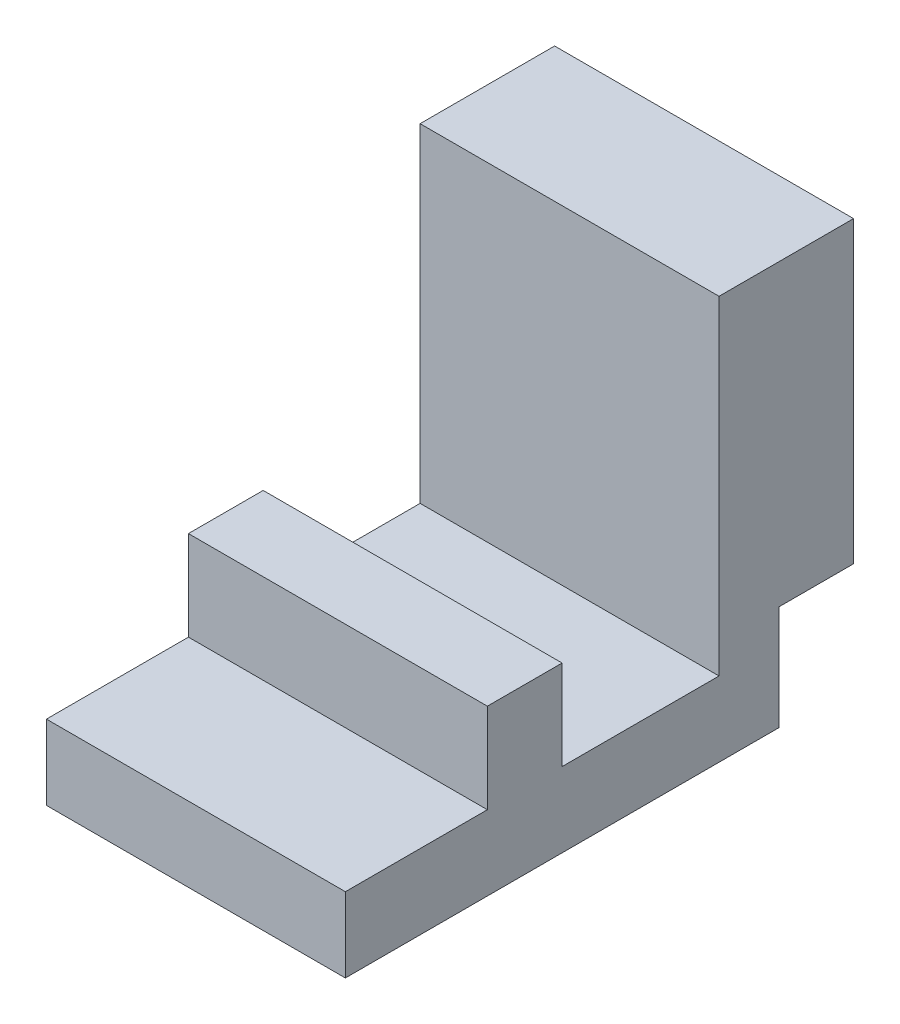
ISO-10303-21;
HEADER;
FILE_DESCRIPTION(('STEP AP214'),'2;1');
FILE_NAME('part.step','',(''),(''),'','','');
FILE_SCHEMA(('AUTOMOTIVE_DESIGN { 1 0 10303 214 1 1 1 1 }'));
ENDSEC;
DATA;
#1=APPLICATION_CONTEXT('core data for automotive mechanical design processes');
#2=APPLICATION_PROTOCOL_DEFINITION('international standard','automotive_design',2000,#1);
#3=PRODUCT_CONTEXT('',#1,'mechanical');
#4=PRODUCT('Part','Part','',(#3));
#5=PRODUCT_RELATED_PRODUCT_CATEGORY('part','',(#4));
#6=PRODUCT_DEFINITION_FORMATION('','',#4);
#7=PRODUCT_DEFINITION_CONTEXT('part definition',#1,'design');
#8=PRODUCT_DEFINITION('design','',#6,#7);
#9=PRODUCT_DEFINITION_SHAPE('','',#8);
#10=(LENGTH_UNIT() NAMED_UNIT(*) SI_UNIT(.MILLI.,.METRE.));
#11=(NAMED_UNIT(*) PLANE_ANGLE_UNIT() SI_UNIT($,.RADIAN.));
#12=(NAMED_UNIT(*) SI_UNIT($,.STERADIAN.) SOLID_ANGLE_UNIT());
#13=UNCERTAINTY_MEASURE_WITH_UNIT(LENGTH_MEASURE(1.E-05),#10,'distance_accuracy_value','');
#14=(GEOMETRIC_REPRESENTATION_CONTEXT(3) GLOBAL_UNCERTAINTY_ASSIGNED_CONTEXT((#13)) GLOBAL_UNIT_ASSIGNED_CONTEXT((#10,
#11,#12)) REPRESENTATION_CONTEXT('',''));
#15=CARTESIAN_POINT('',(0.,0.,0.));
#16=DIRECTION('',(0.,0.,1.));
#17=DIRECTION('',(1.,0.,0.));
#18=AXIS2_PLACEMENT_3D('',#15,#16,#17);
#19=CARTESIAN_POINT('',(20.,0.,58.));
#20=DIRECTION('',(0.,1.,0.));
#21=DIRECTION('',(0.,0.,1.));
#22=AXIS2_PLACEMENT_3D('',#19,#20,#21);
#23=PLANE('',#22);
#24=DIRECTION('',(0.,0.,-1.));
#25=VECTOR('',#24,1.);
#26=CARTESIAN_POINT('',(-20.,0.,58.));
#27=LINE('',#26,#25);
#28=CARTESIAN_POINT('',(-20.,0.,58.));
#29=VERTEX_POINT('',#28);
#30=CARTESIAN_POINT('',(-20.,0.,0.));
#31=VERTEX_POINT('',#30);
#32=EDGE_CURVE('E159',#29,#31,#27,.T.);
#33=ORIENTED_EDGE('',*,*,#32,.T.);
#34=DIRECTION('',(-1.,0.,0.));
#35=VECTOR('',#34,1.);
#36=CARTESIAN_POINT('',(20.,0.,0.));
#37=LINE('',#36,#35);
#38=CARTESIAN_POINT('',(20.,0.,0.));
#39=VERTEX_POINT('',#38);
#40=EDGE_CURVE('E11',#39,#31,#37,.T.);
#41=ORIENTED_EDGE('',*,*,#40,.F.);
#42=DIRECTION('',(0.,0.,-1.));
#43=VECTOR('',#42,1.);
#44=CARTESIAN_POINT('',(20.,0.,58.));
#45=LINE('',#44,#43);
#46=CARTESIAN_POINT('',(20.,0.,58.));
#47=VERTEX_POINT('',#46);
#48=EDGE_CURVE('E181',#47,#39,#45,.T.);
#49=ORIENTED_EDGE('',*,*,#48,.F.);
#50=DIRECTION('',(-1.,0.,0.));
#51=VECTOR('',#50,1.);
#52=CARTESIAN_POINT('',(20.,0.,58.));
#53=LINE('',#52,#51);
#54=EDGE_CURVE('E155',#47,#29,#53,.T.);
#55=ORIENTED_EDGE('',*,*,#54,.T.);
#56=EDGE_LOOP('',(#33,#41,#49,#55));
#57=FACE_BOUND('',#56,.T.);
#58=ADVANCED_FACE('F39',(#57),#23,.F.);
#59=CARTESIAN_POINT('',(20.,0.,0.));
#60=DIRECTION('',(0.,0.,1.));
#61=DIRECTION('',(1.,0.,0.));
#62=AXIS2_PLACEMENT_3D('',#59,#60,#61);
#63=PLANE('',#62);
#64=DIRECTION('',(0.,1.,0.));
#65=VECTOR('',#64,1.);
#66=CARTESIAN_POINT('',(-20.,0.,0.));
#67=LINE('',#66,#65);
#68=CARTESIAN_POINT('',(-20.,14.,0.));
#69=VERTEX_POINT('',#68);
#70=EDGE_CURVE('E162',#31,#69,#67,.T.);
#71=ORIENTED_EDGE('',*,*,#70,.T.);
#72=DIRECTION('',(-1.,0.,0.));
#73=VECTOR('',#72,1.);
#74=CARTESIAN_POINT('',(20.,14.,0.));
#75=LINE('',#74,#73);
#76=CARTESIAN_POINT('',(20.,14.,0.));
#77=VERTEX_POINT('',#76);
#78=EDGE_CURVE('E47',#77,#69,#75,.T.);
#79=ORIENTED_EDGE('',*,*,#78,.F.);
#80=DIRECTION('',(0.,1.,0.));
#81=VECTOR('',#80,1.);
#82=CARTESIAN_POINT('',(20.,0.,0.));
#83=LINE('',#82,#81);
#84=EDGE_CURVE('E110',#39,#77,#83,.T.);
#85=ORIENTED_EDGE('',*,*,#84,.F.);
#86=ORIENTED_EDGE('',*,*,#40,.T.);
#87=EDGE_LOOP('',(#71,#79,#85,#86));
#88=FACE_BOUND('',#87,.T.);
#89=ADVANCED_FACE('F259',(#88),#63,.F.);
#90=CARTESIAN_POINT('',(20.,14.,0.));
#91=DIRECTION('',(0.,1.,0.));
#92=DIRECTION('',(0.,0.,1.));
#93=AXIS2_PLACEMENT_3D('',#90,#91,#92);
#94=PLANE('',#93);
#95=DIRECTION('',(0.,0.,-1.));
#96=VECTOR('',#95,1.);
#97=CARTESIAN_POINT('',(-20.,14.,0.));
#98=LINE('',#97,#96);
#99=CARTESIAN_POINT('',(-20.,14.,-10.));
#100=VERTEX_POINT('',#99);
#101=EDGE_CURVE('E164',#69,#100,#98,.T.);
#102=ORIENTED_EDGE('',*,*,#101,.T.);
#103=DIRECTION('',(-1.,0.,0.));
#104=VECTOR('',#103,1.);
#105=CARTESIAN_POINT('',(20.,14.,-10.));
#106=LINE('',#105,#104);
#107=CARTESIAN_POINT('',(20.,14.,-10.));
#108=VERTEX_POINT('',#107);
#109=EDGE_CURVE('E200',#108,#100,#106,.T.);
#110=ORIENTED_EDGE('',*,*,#109,.F.);
#111=DIRECTION('',(0.,0.,-1.));
#112=VECTOR('',#111,1.);
#113=CARTESIAN_POINT('',(20.,14.,0.));
#114=LINE('',#113,#112);
#115=EDGE_CURVE('E208',#77,#108,#114,.T.);
#116=ORIENTED_EDGE('',*,*,#115,.F.);
#117=ORIENTED_EDGE('',*,*,#78,.T.);
#118=EDGE_LOOP('',(#102,#110,#116,#117));
#119=FACE_BOUND('',#118,.T.);
#120=ADVANCED_FACE('F206',(#119),#94,.F.);
#121=CARTESIAN_POINT('',(20.,14.,-10.));
#122=DIRECTION('',(0.,0.,1.));
#123=DIRECTION('',(0.,-1.,0.));
#124=AXIS2_PLACEMENT_3D('',#121,#122,#123);
#125=PLANE('',#124);
#126=DIRECTION('',(0.,1.,0.));
#127=VECTOR('',#126,1.);
#128=CARTESIAN_POINT('',(-20.,14.,-10.));
#129=LINE('',#128,#127);
#130=CARTESIAN_POINT('',(-20.,54.,-10.));
#131=VERTEX_POINT('',#130);
#132=EDGE_CURVE('E166',#100,#131,#129,.T.);
#133=ORIENTED_EDGE('',*,*,#132,.T.);
#134=DIRECTION('',(-1.,0.,0.));
#135=VECTOR('',#134,1.);
#136=CARTESIAN_POINT('',(20.,54.,-10.));
#137=LINE('',#136,#135);
#138=CARTESIAN_POINT('',(20.,54.,-10.));
#139=VERTEX_POINT('',#138);
#140=EDGE_CURVE('E197',#139,#131,#137,.T.);
#141=ORIENTED_EDGE('',*,*,#140,.F.);
#142=DIRECTION('',(0.,1.,0.));
#143=VECTOR('',#142,1.);
#144=CARTESIAN_POINT('',(20.,14.,-10.));
#145=LINE('',#144,#143);
#146=EDGE_CURVE('E226',#108,#139,#145,.T.);
#147=ORIENTED_EDGE('',*,*,#146,.F.);
#148=ORIENTED_EDGE('',*,*,#109,.T.);
#149=EDGE_LOOP('',(#133,#141,#147,#148));
#150=FACE_BOUND('',#149,.T.);
#151=ADVANCED_FACE('F217',(#150),#125,.F.);
#152=CARTESIAN_POINT('',(20.,54.,-10.));
#153=DIRECTION('',(0.,-1.,0.));
#154=DIRECTION('',(0.,0.,-1.));
#155=AXIS2_PLACEMENT_3D('',#152,#153,#154);
#156=PLANE('',#155);
#157=DIRECTION('',(0.,0.,1.));
#158=VECTOR('',#157,1.);
#159=CARTESIAN_POINT('',(-20.,54.,-10.));
#160=LINE('',#159,#158);
#161=CARTESIAN_POINT('',(-20.,54.,8.));
#162=VERTEX_POINT('',#161);
#163=EDGE_CURVE('E168',#131,#162,#160,.T.);
#164=ORIENTED_EDGE('',*,*,#163,.T.);
#165=DIRECTION('',(-1.,0.,0.));
#166=VECTOR('',#165,1.);
#167=CARTESIAN_POINT('',(20.,54.,8.));
#168=LINE('',#167,#166);
#169=CARTESIAN_POINT('',(20.,54.,8.));
#170=VERTEX_POINT('',#169);
#171=EDGE_CURVE('E194',#170,#162,#168,.T.);
#172=ORIENTED_EDGE('',*,*,#171,.F.);
#173=DIRECTION('',(0.,0.,1.));
#174=VECTOR('',#173,1.);
#175=CARTESIAN_POINT('',(20.,54.,-10.));
#176=LINE('',#175,#174);
#177=EDGE_CURVE('E223',#139,#170,#176,.T.);
#178=ORIENTED_EDGE('',*,*,#177,.F.);
#179=ORIENTED_EDGE('',*,*,#140,.T.);
#180=EDGE_LOOP('',(#164,#172,#178,#179));
#181=FACE_BOUND('',#180,.T.);
#182=ADVANCED_FACE('F221',(#181),#156,.F.);
#183=CARTESIAN_POINT('',(20.,54.,8.));
#184=DIRECTION('',(0.,0.,-1.));
#185=DIRECTION('',(0.,1.,0.));
#186=AXIS2_PLACEMENT_3D('',#183,#184,#185);
#187=PLANE('',#186);
#188=DIRECTION('',(0.,-1.,0.));
#189=VECTOR('',#188,1.);
#190=CARTESIAN_POINT('',(-20.,54.,8.));
#191=LINE('',#190,#189);
#192=CARTESIAN_POINT('',(-20.,10.,7.99999999999999));
#193=VERTEX_POINT('',#192);
#194=EDGE_CURVE('E170',#162,#193,#191,.T.);
#195=ORIENTED_EDGE('',*,*,#194,.T.);
#196=DIRECTION('',(-1.,0.,0.));
#197=VECTOR('',#196,1.);
#198=CARTESIAN_POINT('',(20.,10.,7.99999999999999));
#199=LINE('',#198,#197);
#200=CARTESIAN_POINT('',(20.,10.,7.99999999999999));
#201=VERTEX_POINT('',#200);
#202=EDGE_CURVE('E191',#201,#193,#199,.T.);
#203=ORIENTED_EDGE('',*,*,#202,.F.);
#204=DIRECTION('',(0.,-1.,0.));
#205=VECTOR('',#204,1.);
#206=CARTESIAN_POINT('',(20.,54.,8.));
#207=LINE('',#206,#205);
#208=EDGE_CURVE('E225',#170,#201,#207,.T.);
#209=ORIENTED_EDGE('',*,*,#208,.F.);
#210=ORIENTED_EDGE('',*,*,#171,.T.);
#211=EDGE_LOOP('',(#195,#203,#209,#210));
#212=FACE_BOUND('',#211,.T.);
#213=ADVANCED_FACE('F272',(#212),#187,.F.);
#214=CARTESIAN_POINT('',(20.,10.,7.99999999999999));
#215=DIRECTION('',(0.,-1.,0.));
#216=DIRECTION('',(0.,0.,-1.));
#217=AXIS2_PLACEMENT_3D('',#214,#215,#216);
#218=PLANE('',#217);
#219=DIRECTION('',(0.,0.,1.));
#220=VECTOR('',#219,1.);
#221=CARTESIAN_POINT('',(-20.,10.,7.99999999999999));
#222=LINE('',#221,#220);
#223=CARTESIAN_POINT('',(-20.,10.,29.));
#224=VERTEX_POINT('',#223);
#225=EDGE_CURVE('E172',#193,#224,#222,.T.);
#226=ORIENTED_EDGE('',*,*,#225,.T.);
#227=DIRECTION('',(-1.,0.,0.));
#228=VECTOR('',#227,1.);
#229=CARTESIAN_POINT('',(20.,10.,29.));
#230=LINE('',#229,#228);
#231=CARTESIAN_POINT('',(20.,10.,29.));
#232=VERTEX_POINT('',#231);
#233=EDGE_CURVE('E188',#232,#224,#230,.T.);
#234=ORIENTED_EDGE('',*,*,#233,.F.);
#235=DIRECTION('',(0.,0.,1.));
#236=VECTOR('',#235,1.);
#237=CARTESIAN_POINT('',(20.,10.,7.99999999999999));
#238=LINE('',#237,#236);
#239=EDGE_CURVE('E228',#201,#232,#238,.T.);
#240=ORIENTED_EDGE('',*,*,#239,.F.);
#241=ORIENTED_EDGE('',*,*,#202,.T.);
#242=EDGE_LOOP('',(#226,#234,#240,#241));
#243=FACE_BOUND('',#242,.T.);
#244=ADVANCED_FACE('F275',(#243),#218,.F.);
#245=CARTESIAN_POINT('',(20.,10.,29.));
#246=DIRECTION('',(0.,0.,1.));
#247=DIRECTION('',(0.,-1.,0.));
#248=AXIS2_PLACEMENT_3D('',#245,#246,#247);
#249=PLANE('',#248);
#250=DIRECTION('',(0.,1.,0.));
#251=VECTOR('',#250,1.);
#252=CARTESIAN_POINT('',(-20.,10.,29.));
#253=LINE('',#252,#251);
#254=CARTESIAN_POINT('',(-20.,22.,29.));
#255=VERTEX_POINT('',#254);
#256=EDGE_CURVE('E174',#224,#255,#253,.T.);
#257=ORIENTED_EDGE('',*,*,#256,.T.);
#258=DIRECTION('',(-1.,0.,0.));
#259=VECTOR('',#258,1.);
#260=CARTESIAN_POINT('',(20.,22.,29.));
#261=LINE('',#260,#259);
#262=CARTESIAN_POINT('',(20.,22.,29.));
#263=VERTEX_POINT('',#262);
#264=EDGE_CURVE('E185',#263,#255,#261,.T.);
#265=ORIENTED_EDGE('',*,*,#264,.F.);
#266=DIRECTION('',(0.,1.,0.));
#267=VECTOR('',#266,1.);
#268=CARTESIAN_POINT('',(20.,10.,29.));
#269=LINE('',#268,#267);
#270=EDGE_CURVE('E234',#232,#263,#269,.T.);
#271=ORIENTED_EDGE('',*,*,#270,.F.);
#272=ORIENTED_EDGE('',*,*,#233,.T.);
#273=EDGE_LOOP('',(#257,#265,#271,#272));
#274=FACE_BOUND('',#273,.T.);
#275=ADVANCED_FACE('F240',(#274),#249,.F.);
#276=CARTESIAN_POINT('',(20.,22.,29.));
#277=DIRECTION('',(0.,-1.,0.));
#278=DIRECTION('',(0.,0.,-1.));
#279=AXIS2_PLACEMENT_3D('',#276,#277,#278);
#280=PLANE('',#279);
#281=DIRECTION('',(0.,0.,1.));
#282=VECTOR('',#281,1.);
#283=CARTESIAN_POINT('',(-20.,22.,29.));
#284=LINE('',#283,#282);
#285=CARTESIAN_POINT('',(-20.,22.,39.));
#286=VERTEX_POINT('',#285);
#287=EDGE_CURVE('E176',#255,#286,#284,.T.);
#288=ORIENTED_EDGE('',*,*,#287,.T.);
#289=DIRECTION('',(-1.,0.,0.));
#290=VECTOR('',#289,1.);
#291=CARTESIAN_POINT('',(20.,22.,39.));
#292=LINE('',#291,#290);
#293=CARTESIAN_POINT('',(20.,22.,39.));
#294=VERTEX_POINT('',#293);
#295=EDGE_CURVE('E150',#294,#286,#292,.T.);
#296=ORIENTED_EDGE('',*,*,#295,.F.);
#297=DIRECTION('',(0.,0.,1.));
#298=VECTOR('',#297,1.);
#299=CARTESIAN_POINT('',(20.,22.,29.));
#300=LINE('',#299,#298);
#301=EDGE_CURVE('E141',#263,#294,#300,.T.);
#302=ORIENTED_EDGE('',*,*,#301,.F.);
#303=ORIENTED_EDGE('',*,*,#264,.T.);
#304=EDGE_LOOP('',(#288,#296,#302,#303));
#305=FACE_BOUND('',#304,.T.);
#306=ADVANCED_FACE('F244',(#305),#280,.F.);
#307=CARTESIAN_POINT('',(20.,22.,39.));
#308=DIRECTION('',(0.,0.,-1.));
#309=DIRECTION('',(0.,1.,0.));
#310=AXIS2_PLACEMENT_3D('',#307,#308,#309);
#311=PLANE('',#310);
#312=DIRECTION('',(0.,-1.,0.));
#313=VECTOR('',#312,1.);
#314=CARTESIAN_POINT('',(-20.,22.,39.));
#315=LINE('',#314,#313);
#316=CARTESIAN_POINT('',(-20.,10.,39.));
#317=VERTEX_POINT('',#316);
#318=EDGE_CURVE('E149',#286,#317,#315,.T.);
#319=ORIENTED_EDGE('',*,*,#318,.T.);
#320=DIRECTION('',(-1.,0.,0.));
#321=VECTOR('',#320,1.);
#322=CARTESIAN_POINT('',(20.,10.,39.));
#323=LINE('',#322,#321);
#324=CARTESIAN_POINT('',(20.,10.,39.));
#325=VERTEX_POINT('',#324);
#326=EDGE_CURVE('E146',#325,#317,#323,.T.);
#327=ORIENTED_EDGE('',*,*,#326,.F.);
#328=DIRECTION('',(0.,-1.,0.));
#329=VECTOR('',#328,1.);
#330=CARTESIAN_POINT('',(20.,22.,39.));
#331=LINE('',#330,#329);
#332=EDGE_CURVE('E135',#294,#325,#331,.T.);
#333=ORIENTED_EDGE('',*,*,#332,.F.);
#334=ORIENTED_EDGE('',*,*,#295,.T.);
#335=EDGE_LOOP('',(#319,#327,#333,#334));
#336=FACE_BOUND('',#335,.T.);
#337=ADVANCED_FACE('F147',(#336),#311,.F.);
#338=CARTESIAN_POINT('',(20.,10.,39.));
#339=DIRECTION('',(0.,-1.,0.));
#340=DIRECTION('',(0.,0.,-1.));
#341=AXIS2_PLACEMENT_3D('',#338,#339,#340);
#342=PLANE('',#341);
#343=DIRECTION('',(0.,0.,1.));
#344=VECTOR('',#343,1.);
#345=CARTESIAN_POINT('',(-20.,10.,39.));
#346=LINE('',#345,#344);
#347=CARTESIAN_POINT('',(-20.,10.,58.));
#348=VERTEX_POINT('',#347);
#349=EDGE_CURVE('E96',#317,#348,#346,.T.);
#350=ORIENTED_EDGE('',*,*,#349,.T.);
#351=DIRECTION('',(-1.,0.,0.));
#352=VECTOR('',#351,1.);
#353=CARTESIAN_POINT('',(20.,10.,58.));
#354=LINE('',#353,#352);
#355=CARTESIAN_POINT('',(20.,10.,58.));
#356=VERTEX_POINT('',#355);
#357=EDGE_CURVE('E151',#356,#348,#354,.T.);
#358=ORIENTED_EDGE('',*,*,#357,.F.);
#359=DIRECTION('',(0.,0.,1.));
#360=VECTOR('',#359,1.);
#361=CARTESIAN_POINT('',(20.,10.,39.));
#362=LINE('',#361,#360);
#363=EDGE_CURVE('E139',#325,#356,#362,.T.);
#364=ORIENTED_EDGE('',*,*,#363,.F.);
#365=ORIENTED_EDGE('',*,*,#326,.T.);
#366=EDGE_LOOP('',(#350,#358,#364,#365));
#367=FACE_BOUND('',#366,.T.);
#368=ADVANCED_FACE('F153',(#367),#342,.F.);
#369=CARTESIAN_POINT('',(20.,10.,58.));
#370=DIRECTION('',(0.,0.,-1.));
#371=DIRECTION('',(-1.,0.,0.));
#372=AXIS2_PLACEMENT_3D('',#369,#370,#371);
#373=PLANE('',#372);
#374=DIRECTION('',(0.,-1.,0.));
#375=VECTOR('',#374,1.);
#376=CARTESIAN_POINT('',(-20.,10.,58.));
#377=LINE('',#376,#375);
#378=EDGE_CURVE('E102',#348,#29,#377,.T.);
#379=ORIENTED_EDGE('',*,*,#378,.T.);
#380=ORIENTED_EDGE('',*,*,#54,.F.);
#381=DIRECTION('',(0.,-1.,0.));
#382=VECTOR('',#381,1.);
#383=CARTESIAN_POINT('',(20.,10.,58.));
#384=LINE('',#383,#382);
#385=EDGE_CURVE('E55',#356,#47,#384,.T.);
#386=ORIENTED_EDGE('',*,*,#385,.F.);
#387=ORIENTED_EDGE('',*,*,#357,.T.);
#388=EDGE_LOOP('',(#379,#380,#386,#387));
#389=FACE_BOUND('',#388,.T.);
#390=ADVANCED_FACE('F248',(#389),#373,.F.);
#391=CARTESIAN_POINT('',(20.,0.,0.));
#392=DIRECTION('',(1.,0.,0.));
#393=DIRECTION('',(0.,0.,-1.));
#394=AXIS2_PLACEMENT_3D('',#391,#392,#393);
#395=PLANE('',#394);
#396=ORIENTED_EDGE('',*,*,#48,.T.);
#397=ORIENTED_EDGE('',*,*,#84,.T.);
#398=ORIENTED_EDGE('',*,*,#115,.T.);
#399=ORIENTED_EDGE('',*,*,#146,.T.);
#400=ORIENTED_EDGE('',*,*,#177,.T.);
#401=ORIENTED_EDGE('',*,*,#208,.T.);
#402=ORIENTED_EDGE('',*,*,#239,.T.);
#403=ORIENTED_EDGE('',*,*,#270,.T.);
#404=ORIENTED_EDGE('',*,*,#301,.T.);
#405=ORIENTED_EDGE('',*,*,#332,.T.);
#406=ORIENTED_EDGE('',*,*,#363,.T.);
#407=ORIENTED_EDGE('',*,*,#385,.T.);
#408=EDGE_LOOP('',(#396,#397,#398,#399,#400,#401,#402,#403,#404,#405,#406,#407));
#409=FACE_BOUND('',#408,.T.);
#410=ADVANCED_FACE('F137',(#409),#395,.T.);
#411=CARTESIAN_POINT('',(-20.,0.,0.));
#412=DIRECTION('',(1.,0.,0.));
#413=DIRECTION('',(0.,0.,-1.));
#414=AXIS2_PLACEMENT_3D('',#411,#412,#413);
#415=PLANE('',#414);
#416=ORIENTED_EDGE('',*,*,#32,.F.);
#417=ORIENTED_EDGE('',*,*,#378,.F.);
#418=ORIENTED_EDGE('',*,*,#349,.F.);
#419=ORIENTED_EDGE('',*,*,#318,.F.);
#420=ORIENTED_EDGE('',*,*,#287,.F.);
#421=ORIENTED_EDGE('',*,*,#256,.F.);
#422=ORIENTED_EDGE('',*,*,#225,.F.);
#423=ORIENTED_EDGE('',*,*,#194,.F.);
#424=ORIENTED_EDGE('',*,*,#163,.F.);
#425=ORIENTED_EDGE('',*,*,#132,.F.);
#426=ORIENTED_EDGE('',*,*,#101,.F.);
#427=ORIENTED_EDGE('',*,*,#70,.F.);
#428=EDGE_LOOP('',(#416,#417,#418,#419,#420,#421,#422,#423,#424,#425,#426,#427));
#429=FACE_BOUND('',#428,.T.);
#430=ADVANCED_FACE('F212',(#429),#415,.F.);
#431=CLOSED_SHELL('',(#58,#89,#120,#151,#182,#213,#244,#275,#306,#337,#368,#390,#410,#430));
#432=MANIFOLD_SOLID_BREP('B2',#431);
#433=ADVANCED_BREP_SHAPE_REPRESENTATION('',(#18,#432),#14);
#434=SHAPE_DEFINITION_REPRESENTATION(#9,#433);
ENDSEC;
END-ISO-10303-21;
